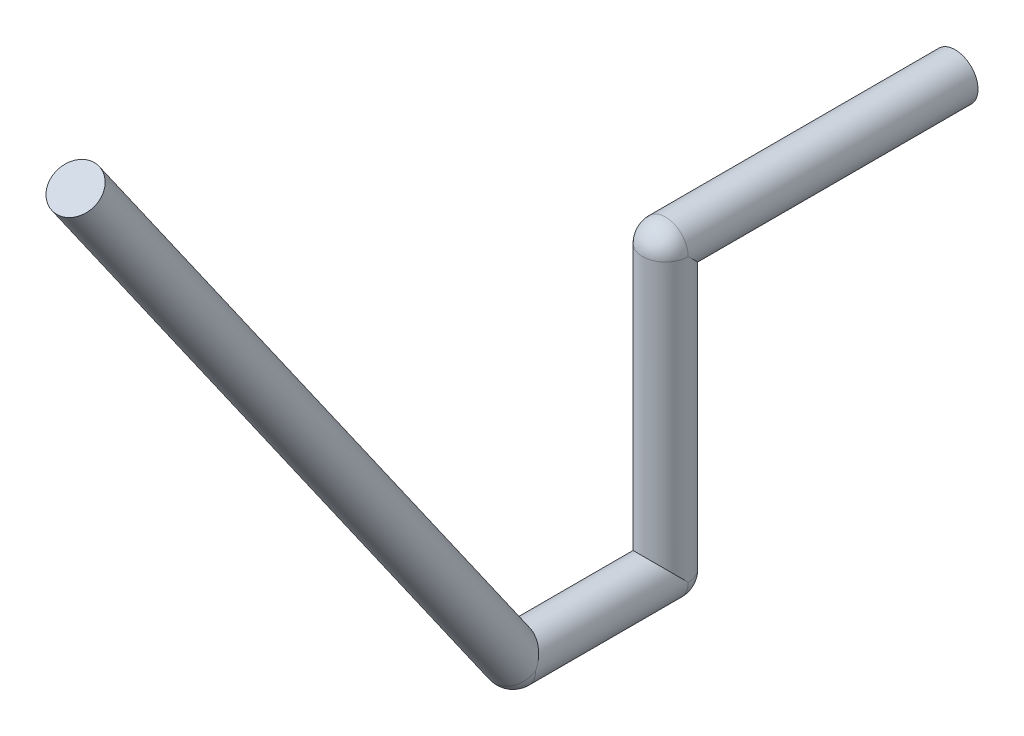
ISO-10303-21;
HEADER;
FILE_DESCRIPTION(('STEP AP214'),'2;1');
FILE_NAME('part.step','',(''),(''),'','','');
FILE_SCHEMA(('AUTOMOTIVE_DESIGN { 1 0 10303 214 1 1 1 1 }'));
ENDSEC;
DATA;
#1=APPLICATION_CONTEXT('core data for automotive mechanical design processes');
#2=APPLICATION_PROTOCOL_DEFINITION('international standard','automotive_design',2000,#1);
#3=PRODUCT_CONTEXT('',#1,'mechanical');
#4=PRODUCT('Part','Part','',(#3));
#5=PRODUCT_RELATED_PRODUCT_CATEGORY('part','',(#4));
#6=PRODUCT_DEFINITION_FORMATION('','',#4);
#7=PRODUCT_DEFINITION_CONTEXT('part definition',#1,'design');
#8=PRODUCT_DEFINITION('design','',#6,#7);
#9=PRODUCT_DEFINITION_SHAPE('','',#8);
#10=(LENGTH_UNIT() NAMED_UNIT(*) SI_UNIT(.MILLI.,.METRE.));
#11=(NAMED_UNIT(*) PLANE_ANGLE_UNIT() SI_UNIT($,.RADIAN.));
#12=(NAMED_UNIT(*) SI_UNIT($,.STERADIAN.) SOLID_ANGLE_UNIT());
#13=UNCERTAINTY_MEASURE_WITH_UNIT(LENGTH_MEASURE(1.E-05),#10,'distance_accuracy_value','');
#14=(GEOMETRIC_REPRESENTATION_CONTEXT(3) GLOBAL_UNCERTAINTY_ASSIGNED_CONTEXT((#13)) GLOBAL_UNIT_ASSIGNED_CONTEXT((#10,
#11,#12)) REPRESENTATION_CONTEXT('',''));
#15=CARTESIAN_POINT('',(0.,0.,0.));
#16=DIRECTION('',(0.,0.,1.));
#17=DIRECTION('',(1.,0.,0.));
#18=AXIS2_PLACEMENT_3D('',#15,#16,#17);
#19=CARTESIAN_POINT('',(1.8,8.,-2.5));
#20=DIRECTION('',(0.,0.,1.));
#21=DIRECTION('',(1.,0.,0.));
#22=AXIS2_PLACEMENT_3D('',#19,#20,#21);
#23=PLANE('',#22);
#24=CARTESIAN_POINT('',(1.8,8.,-2.5));
#25=DIRECTION('',(0.,0.,1.));
#26=DIRECTION('',(1.,0.,0.));
#27=AXIS2_PLACEMENT_3D('',#24,#25,#26);
#28=CIRCLE('',#27,0.3);
#29=CARTESIAN_POINT('',(2.1,8.,-2.5));
#30=VERTEX_POINT('',#29);
#31=EDGE_CURVE('E19',#30,#30,#28,.T.);
#32=ORIENTED_EDGE('',*,*,#31,.F.);
#33=EDGE_LOOP('',(#32));
#34=FACE_BOUND('',#33,.T.);
#35=ADVANCED_FACE('F16',(#34),#23,.F.);
#36=CARTESIAN_POINT('',(1.8,8.,1.3));
#37=DIRECTION('',(1.,0.,0.));
#38=DIRECTION('',(0.,1.,0.));
#39=AXIS2_PLACEMENT_3D('',#36,#37,#38);
#40=SPHERICAL_SURFACE('',#39,0.3);
#41=CARTESIAN_POINT('',(1.8,8.,1.3));
#42=DIRECTION('',(0.,-1.,0.));
#43=DIRECTION('',(0.,0.,-1.));
#44=AXIS2_PLACEMENT_3D('',#41,#42,#43);
#45=CIRCLE('',#44,0.3);
#46=CARTESIAN_POINT('',(2.1,8.,1.3));
#47=VERTEX_POINT('',#46);
#48=CARTESIAN_POINT('',(1.5,8.,1.3));
#49=VERTEX_POINT('',#48);
#50=EDGE_CURVE('E50',#47,#49,#45,.T.);
#51=ORIENTED_EDGE('',*,*,#50,.F.);
#52=CARTESIAN_POINT('',(1.8,8.,1.3));
#53=DIRECTION('',(0.,0.,1.));
#54=DIRECTION('',(1.,0.,0.));
#55=AXIS2_PLACEMENT_3D('',#52,#53,#54);
#56=CIRCLE('',#55,0.3);
#57=EDGE_CURVE('E47',#49,#47,#56,.F.);
#58=ORIENTED_EDGE('',*,*,#57,.F.);
#59=EDGE_LOOP('',(#51,#58));
#60=FACE_BOUND('',#59,.T.);
#61=ADVANCED_FACE('F51',(#60),#40,.T.);
#62=CARTESIAN_POINT('',(1.8,8.,-2.5));
#63=DIRECTION('',(0.,0.,1.));
#64=DIRECTION('',(1.,0.,0.));
#65=AXIS2_PLACEMENT_3D('',#62,#63,#64);
#66=CYLINDRICAL_SURFACE('',#65,0.3);
#67=ORIENTED_EDGE('',*,*,#57,.T.);
#68=CARTESIAN_POINT('',(1.8,8.,1.3));
#69=DIRECTION('',(0.,-0.707106781186548,0.707106781186547));
#70=DIRECTION('',(0.,-0.707106781186547,-0.707106781186548));
#71=AXIS2_PLACEMENT_3D('',#68,#69,#70);
#72=ELLIPSE('',#71,0.424264068711929,0.3);
#73=EDGE_CURVE('E54',#49,#47,#72,.T.);
#74=ORIENTED_EDGE('',*,*,#73,.F.);
#75=EDGE_LOOP('',(#67,#74));
#76=FACE_BOUND('',#75,.T.);
#77=ORIENTED_EDGE('',*,*,#31,.T.);
#78=EDGE_LOOP('',(#77));
#79=FACE_BOUND('',#78,.T.);
#80=ADVANCED_FACE('F57',(#76,#79),#66,.T.);
#81=CARTESIAN_POINT('',(1.8,8.,1.3));
#82=DIRECTION('',(0.,-1.,0.));
#83=DIRECTION('',(0.,0.,-1.));
#84=AXIS2_PLACEMENT_3D('',#81,#82,#83);
#85=CYLINDRICAL_SURFACE('',#84,0.3);
#86=CARTESIAN_POINT('',(1.8,4.3,1.3));
#87=DIRECTION('',(0.,-0.707106781186548,0.707106781186547));
#88=DIRECTION('',(0.,-0.707106781186547,-0.707106781186548));
#89=AXIS2_PLACEMENT_3D('',#86,#87,#88);
#90=ELLIPSE('',#89,0.424264068711929,0.3);
#91=CARTESIAN_POINT('',(2.1,4.3,1.3));
#92=VERTEX_POINT('',#91);
#93=CARTESIAN_POINT('',(1.5,4.3,1.3));
#94=VERTEX_POINT('',#93);
#95=EDGE_CURVE('E62',#92,#94,#90,.T.);
#96=ORIENTED_EDGE('',*,*,#95,.F.);
#97=CARTESIAN_POINT('',(1.8,4.3,1.3));
#98=DIRECTION('',(0.,1.,0.));
#99=DIRECTION('',(1.,0.,0.));
#100=AXIS2_PLACEMENT_3D('',#97,#98,#99);
#101=CIRCLE('',#100,0.3);
#102=EDGE_CURVE('E61',#94,#92,#101,.F.);
#103=ORIENTED_EDGE('',*,*,#102,.F.);
#104=EDGE_LOOP('',(#96,#103));
#105=FACE_BOUND('',#104,.T.);
#106=ORIENTED_EDGE('',*,*,#73,.T.);
#107=ORIENTED_EDGE('',*,*,#50,.T.);
#108=EDGE_LOOP('',(#106,#107));
#109=FACE_BOUND('',#108,.T.);
#110=ADVANCED_FACE('F60',(#105,#109),#85,.T.);
#111=CARTESIAN_POINT('',(1.8,4.3,1.3));
#112=DIRECTION('',(1.,0.,0.));
#113=DIRECTION('',(0.,1.,0.));
#114=AXIS2_PLACEMENT_3D('',#111,#112,#113);
#115=SPHERICAL_SURFACE('',#114,0.3);
#116=CARTESIAN_POINT('',(1.8,4.3,1.3));
#117=DIRECTION('',(0.,0.,1.));
#118=DIRECTION('',(1.,0.,0.));
#119=AXIS2_PLACEMENT_3D('',#116,#117,#118);
#120=CIRCLE('',#119,0.3);
#121=EDGE_CURVE('E67',#94,#92,#120,.T.);
#122=ORIENTED_EDGE('',*,*,#121,.F.);
#123=ORIENTED_EDGE('',*,*,#102,.T.);
#124=EDGE_LOOP('',(#122,#123));
#125=FACE_BOUND('',#124,.T.);
#126=ADVANCED_FACE('F78',(#125),#115,.T.);
#127=CARTESIAN_POINT('',(1.8,4.3,3.3));
#128=DIRECTION('',(1.,0.,0.));
#129=DIRECTION('',(0.,1.,0.));
#130=AXIS2_PLACEMENT_3D('',#127,#128,#129);
#131=SPHERICAL_SURFACE('',#130,0.3);
#132=CARTESIAN_POINT('',(1.8,4.3,3.3));
#133=DIRECTION('',(0.,0.,1.));
#134=DIRECTION('',(1.,0.,0.));
#135=AXIS2_PLACEMENT_3D('',#132,#133,#134);
#136=CIRCLE('',#135,0.3);
#137=CARTESIAN_POINT('',(2.1,4.3,3.3));
#138=VERTEX_POINT('',#137);
#139=CARTESIAN_POINT('',(1.5,4.3,3.3));
#140=VERTEX_POINT('',#139);
#141=EDGE_CURVE('E68',#138,#140,#136,.F.);
#142=ORIENTED_EDGE('',*,*,#141,.F.);
#143=CARTESIAN_POINT('',(1.8,4.3,3.3));
#144=DIRECTION('',(0.,0.819152044289016,0.573576436351011));
#145=DIRECTION('',(0.,-0.573576436351011,0.819152044289016));
#146=AXIS2_PLACEMENT_3D('',#143,#144,#145);
#147=CIRCLE('',#146,0.3);
#148=EDGE_CURVE('E25',#140,#138,#147,.T.);
#149=ORIENTED_EDGE('',*,*,#148,.F.);
#150=EDGE_LOOP('',(#142,#149));
#151=FACE_BOUND('',#150,.T.);
#152=ADVANCED_FACE('F83',(#151),#131,.T.);
#153=CARTESIAN_POINT('',(1.8,12.49152044289,9.03576436351));
#154=DIRECTION('',(0.,0.819152044289016,0.573576436351011));
#155=DIRECTION('',(0.,-0.573576436351011,0.819152044289016));
#156=AXIS2_PLACEMENT_3D('',#153,#154,#155);
#157=PLANE('',#156);
#158=CARTESIAN_POINT('',(1.8,12.49152044289,9.03576436351));
#159=DIRECTION('',(0.,0.819152044289016,0.573576436351011));
#160=DIRECTION('',(0.,-0.573576436351011,0.819152044289016));
#161=AXIS2_PLACEMENT_3D('',#158,#159,#160);
#162=CIRCLE('',#161,0.3);
#163=CARTESIAN_POINT('',(1.8,12.3194475119847,9.2815099767967));
#164=VERTEX_POINT('',#163);
#165=EDGE_CURVE('E11',#164,#164,#162,.F.);
#166=ORIENTED_EDGE('',*,*,#165,.F.);
#167=EDGE_LOOP('',(#166));
#168=FACE_BOUND('',#167,.T.);
#169=ADVANCED_FACE('F104',(#168),#157,.T.);
#170=CARTESIAN_POINT('',(1.8,4.3,1.3));
#171=DIRECTION('',(0.,0.,1.));
#172=DIRECTION('',(1.,0.,0.));
#173=AXIS2_PLACEMENT_3D('',#170,#171,#172);
#174=CYLINDRICAL_SURFACE('',#173,0.3);
#175=CARTESIAN_POINT('',(1.8,4.3,3.3));
#176=DIRECTION('',(0.,0.461748613235053,0.887010833178212));
#177=DIRECTION('',(0.,-0.887010833178212,0.461748613235053));
#178=AXIS2_PLACEMENT_3D('',#175,#176,#177);
#179=ELLIPSE('',#178,0.338214584059906,0.3);
#180=EDGE_CURVE('E33',#138,#140,#179,.T.);
#181=ORIENTED_EDGE('',*,*,#180,.F.);
#182=ORIENTED_EDGE('',*,*,#141,.T.);
#183=EDGE_LOOP('',(#181,#182));
#184=FACE_BOUND('',#183,.T.);
#185=ORIENTED_EDGE('',*,*,#121,.T.);
#186=ORIENTED_EDGE('',*,*,#95,.T.);
#187=EDGE_LOOP('',(#185,#186));
#188=FACE_BOUND('',#187,.T.);
#189=ADVANCED_FACE('F101',(#184,#188),#174,.T.);
#190=CARTESIAN_POINT('',(1.8,4.3,3.3));
#191=DIRECTION('',(0.,0.819152044289016,0.573576436351011));
#192=DIRECTION('',(0.,-0.573576436351011,0.819152044289016));
#193=AXIS2_PLACEMENT_3D('',#190,#191,#192);
#194=CYLINDRICAL_SURFACE('',#193,0.3);
#195=ORIENTED_EDGE('',*,*,#165,.T.);
#196=EDGE_LOOP('',(#195));
#197=FACE_BOUND('',#196,.T.);
#198=ORIENTED_EDGE('',*,*,#148,.T.);
#199=ORIENTED_EDGE('',*,*,#180,.T.);
#200=EDGE_LOOP('',(#198,#199));
#201=FACE_BOUND('',#200,.T.);
#202=ADVANCED_FACE('F99',(#197,#201),#194,.T.);
#203=CLOSED_SHELL('',(#35,#61,#80,#110,#126,#152,#169,#189,#202));
#204=MANIFOLD_SOLID_BREP('B1',#203);
#205=ADVANCED_BREP_SHAPE_REPRESENTATION('',(#18,#204),#14);
#206=SHAPE_DEFINITION_REPRESENTATION(#9,#205);
ENDSEC;
END-ISO-10303-21;
